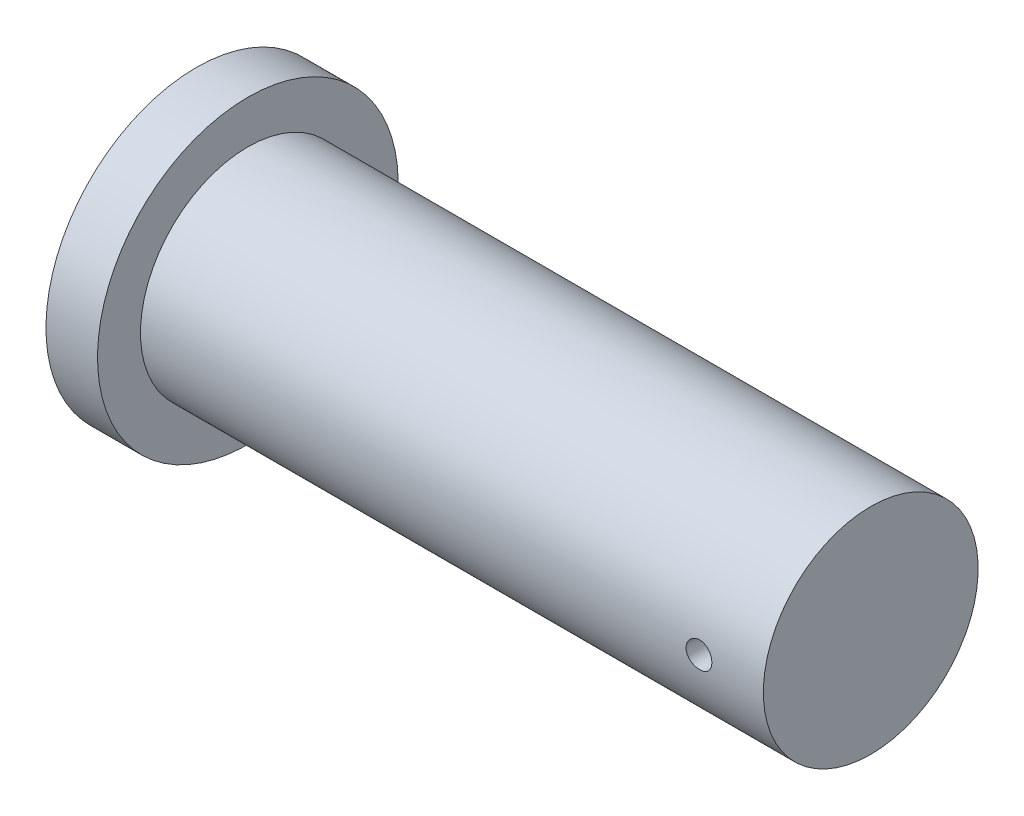
ISO-10303-21;
HEADER;
FILE_DESCRIPTION(('STEP AP214'),'2;1');
FILE_NAME('part.step','',(''),(''),'','','');
FILE_SCHEMA(('AUTOMOTIVE_DESIGN { 1 0 10303 214 1 1 1 1 }'));
ENDSEC;
DATA;
#1=APPLICATION_CONTEXT('core data for automotive mechanical design processes');
#2=APPLICATION_PROTOCOL_DEFINITION('international standard','automotive_design',2000,#1);
#3=PRODUCT_CONTEXT('',#1,'mechanical');
#4=PRODUCT('Part','Part','',(#3));
#5=PRODUCT_RELATED_PRODUCT_CATEGORY('part','',(#4));
#6=PRODUCT_DEFINITION_FORMATION('','',#4);
#7=PRODUCT_DEFINITION_CONTEXT('part definition',#1,'design');
#8=PRODUCT_DEFINITION('design','',#6,#7);
#9=PRODUCT_DEFINITION_SHAPE('','',#8);
#10=(LENGTH_UNIT() NAMED_UNIT(*) SI_UNIT(.MILLI.,.METRE.));
#11=(NAMED_UNIT(*) PLANE_ANGLE_UNIT() SI_UNIT($,.RADIAN.));
#12=(NAMED_UNIT(*) SI_UNIT($,.STERADIAN.) SOLID_ANGLE_UNIT());
#13=UNCERTAINTY_MEASURE_WITH_UNIT(LENGTH_MEASURE(1.E-05),#10,'distance_accuracy_value','');
#14=(GEOMETRIC_REPRESENTATION_CONTEXT(3) GLOBAL_UNCERTAINTY_ASSIGNED_CONTEXT((#13)) GLOBAL_UNIT_ASSIGNED_CONTEXT((#10,
#11,#12)) REPRESENTATION_CONTEXT('',''));
#15=CARTESIAN_POINT('',(0.,0.,0.));
#16=DIRECTION('',(0.,0.,1.));
#17=DIRECTION('',(1.,0.,0.));
#18=AXIS2_PLACEMENT_3D('',#15,#16,#17);
#19=CARTESIAN_POINT('',(-157.,0.,0.));
#20=DIRECTION('',(-1.,0.,0.));
#21=DIRECTION('',(0.,-1.,0.));
#22=AXIS2_PLACEMENT_3D('',#19,#20,#21);
#23=PLANE('',#22);
#24=CARTESIAN_POINT('',(-157.,0.,0.));
#25=DIRECTION('',(1.,0.,0.));
#26=DIRECTION('',(0.,1.,0.));
#27=AXIS2_PLACEMENT_3D('',#24,#25,#26);
#28=CIRCLE('',#27,35.);
#29=CARTESIAN_POINT('',(-157.,35.,0.));
#30=VERTEX_POINT('',#29);
#31=EDGE_CURVE('E10',#30,#30,#28,.T.);
#32=ORIENTED_EDGE('',*,*,#31,.F.);
#33=EDGE_LOOP('',(#32));
#34=FACE_BOUND('',#33,.T.);
#35=ADVANCED_FACE('F37',(#34),#23,.T.);
#36=CARTESIAN_POINT('',(0.,0.,0.));
#37=DIRECTION('',(1.,0.,0.));
#38=DIRECTION('',(0.,1.,0.));
#39=AXIS2_PLACEMENT_3D('',#36,#37,#38);
#40=CYLINDRICAL_SURFACE('',#39,35.);
#41=ORIENTED_EDGE('',*,*,#31,.T.);
#42=EDGE_LOOP('',(#41));
#43=FACE_BOUND('',#42,.T.);
#44=CARTESIAN_POINT('',(-145.,0.,0.));
#45=DIRECTION('',(1.,0.,0.));
#46=DIRECTION('',(0.,1.,0.));
#47=AXIS2_PLACEMENT_3D('',#44,#45,#46);
#48=CIRCLE('',#47,35.);
#49=CARTESIAN_POINT('',(-145.,35.,0.));
#50=VERTEX_POINT('',#49);
#51=EDGE_CURVE('E50',#50,#50,#48,.T.);
#52=ORIENTED_EDGE('',*,*,#51,.F.);
#53=EDGE_LOOP('',(#52));
#54=FACE_BOUND('',#53,.T.);
#55=ADVANCED_FACE('F84',(#43,#54),#40,.T.);
#56=CARTESIAN_POINT('',(-145.,35.,0.));
#57=DIRECTION('',(1.,0.,0.));
#58=DIRECTION('',(0.,1.,0.));
#59=AXIS2_PLACEMENT_3D('',#56,#57,#58);
#60=PLANE('',#59);
#61=ORIENTED_EDGE('',*,*,#51,.T.);
#62=EDGE_LOOP('',(#61));
#63=FACE_BOUND('',#62,.T.);
#64=CARTESIAN_POINT('',(-145.,0.,0.));
#65=DIRECTION('',(1.,0.,0.));
#66=DIRECTION('',(0.,1.,0.));
#67=AXIS2_PLACEMENT_3D('',#64,#65,#66);
#68=CIRCLE('',#67,25.);
#69=CARTESIAN_POINT('',(-145.,25.,0.));
#70=VERTEX_POINT('',#69);
#71=EDGE_CURVE('E56',#70,#70,#68,.T.);
#72=ORIENTED_EDGE('',*,*,#71,.F.);
#73=EDGE_LOOP('',(#72));
#74=FACE_BOUND('',#73,.T.);
#75=ADVANCED_FACE('F80',(#63,#74),#60,.T.);
#76=CARTESIAN_POINT('',(0.,0.,0.));
#77=DIRECTION('',(1.,0.,0.));
#78=DIRECTION('',(0.,1.,0.));
#79=AXIS2_PLACEMENT_3D('',#76,#77,#78);
#80=CYLINDRICAL_SURFACE('',#79,25.);
#81=CARTESIAN_POINT('',(-12.,0.,-25.));
#82=CARTESIAN_POINT('',(-12.0000071639414,-0.1678640471077,-24.9999977357459));
#83=CARTESIAN_POINT('',(-12.0141366586927,-0.335834317331192,-24.9982914200408));
#84=CARTESIAN_POINT('',(-12.0702810641554,-0.66710457130825,-24.991648705422));
#85=CARTESIAN_POINT('',(-12.1123254412506,-0.830399429590069,-24.9867088933728));
#86=CARTESIAN_POINT('',(-12.223046276526,-1.14747479534053,-24.9741559265426));
#87=CARTESIAN_POINT('',(-12.2917052068242,-1.30126148759225,-24.9665445315309));
#88=CARTESIAN_POINT('',(-12.4536687350833,-1.595099157832,-24.9494959264345));
#89=CARTESIAN_POINT('',(-12.5469689597533,-1.73515256713516,-24.9400590404141));
#90=CARTESIAN_POINT('',(-12.7560748619752,-1.99829131534451,-24.920360105442));
#91=CARTESIAN_POINT('',(-12.8719808401119,-2.1212966913072,-24.9100945030904));
#92=CARTESIAN_POINT('',(-13.1227929648879,-2.34615931038342,-24.8899239397152));
#93=CARTESIAN_POINT('',(-13.2577000590186,-2.44801549826474,-24.8800189967068));
#94=CARTESIAN_POINT('',(-13.5432008252984,-2.62798342873896,-24.8616560370404));
#95=CARTESIAN_POINT('',(-13.6938417245801,-2.7060207567257,-24.8532025903971));
#96=CARTESIAN_POINT('',(-14.0062087021087,-2.8356605730156,-24.8387461344686));
#97=CARTESIAN_POINT('',(-14.1679343919693,-2.88726398696776,-24.8327430393798));
#98=CARTESIAN_POINT('',(-14.4970528593114,-2.962329300454,-24.8239006073737));
#99=CARTESIAN_POINT('',(-14.6644145284277,-2.98592577987646,-24.8210461452543));
#100=CARTESIAN_POINT('',(-15.0007449363642,-3.0047237521967,-24.8187777690611));
#101=CARTESIAN_POINT('',(-15.169713615217,-2.99992630052848,-24.8193637271032));
#102=CARTESIAN_POINT('',(-15.5035259647843,-2.96218316078668,-24.8238961466306));
#103=CARTESIAN_POINT('',(-15.6683866386802,-2.92938543222303,-24.8278249434675));
#104=CARTESIAN_POINT('',(-15.9902470278213,-2.83680346170067,-24.8385728087608));
#105=CARTESIAN_POINT('',(-16.147246595179,-2.77701871225814,-24.8453919315687));
#106=CARTESIAN_POINT('',(-16.4493894682391,-2.63199980699862,-24.8611722079476));
#107=CARTESIAN_POINT('',(-16.5945014783535,-2.54670106203925,-24.8701387862198));
#108=CARTESIAN_POINT('',(-16.8684072109158,-2.35312173169469,-24.8891993987901));
#109=CARTESIAN_POINT('',(-16.9972002449026,-2.24484017723157,-24.8992934806213));
#110=CARTESIAN_POINT('',(-17.2356710843644,-2.0075475556218,-24.9195503308637));
#111=CARTESIAN_POINT('',(-17.345221969857,-1.87840890051216,-24.929713127424));
#112=CARTESIAN_POINT('',(-17.5411115210003,-1.60350795893872,-24.9489020798549));
#113=CARTESIAN_POINT('',(-17.6274501400191,-1.45774563908005,-24.9579282334421));
#114=CARTESIAN_POINT('',(-17.7744632856396,-1.15363930826284,-24.9738318861702));
#115=CARTESIAN_POINT('',(-17.8351301933304,-0.995291578715591,-24.9807087472809));
#116=CARTESIAN_POINT('',(-17.9289787378509,-0.67055602227344,-24.991533065309));
#117=CARTESIAN_POINT('',(-17.9621615600045,-0.504168542441624,-24.9954806485584));
#118=CARTESIAN_POINT('',(-17.9999362554977,-0.169174396374217,-24.9999852500304));
#119=CARTESIAN_POINT('',(-18.0047030324007,-0.000587720432051824,-25.0005630093753));
#120=CARTESIAN_POINT('',(-17.9859714221317,0.33498206824326,-24.9983187823231));
#121=CARTESIAN_POINT('',(-17.9624735887046,0.501965212327328,-24.9954968625308));
#122=CARTESIAN_POINT('',(-17.8880250359969,0.829074263928356,-24.9867833380686));
#123=CARTESIAN_POINT('',(-17.8371573869499,0.989219346369034,-24.9809010237909));
#124=CARTESIAN_POINT('',(-17.7094992966464,1.29870539768646,-24.9667255501792));
#125=CARTESIAN_POINT('',(-17.6327080385099,1.44804602592347,-24.9584323148759));
#126=CARTESIAN_POINT('',(-17.4549570840976,1.73246717766504,-24.9403085158695));
#127=CARTESIAN_POINT('',(-17.3538838621892,1.86747628962751,-24.9304708084643));
#128=CARTESIAN_POINT('',(-17.1305991535918,2.11867625152204,-24.9103817919419));
#129=CARTESIAN_POINT('',(-17.008386895852,2.23486641472949,-24.9001304677484));
#130=CARTESIAN_POINT('',(-16.7455243845723,2.44574795226154,-24.8803059484942));
#131=CARTESIAN_POINT('',(-16.6047809846561,2.54032363231939,-24.8707365831307));
#132=CARTESIAN_POINT('',(-16.3093049749244,2.70449314429332,-24.8534214993383));
#133=CARTESIAN_POINT('',(-16.1545726268817,2.77408744356074,-24.8456757467942));
#134=CARTESIAN_POINT('',(-15.8358893911053,2.88612996668159,-24.8329105734502));
#135=CARTESIAN_POINT('',(-15.6719619881406,2.92864420159346,-24.8278845275633));
#136=CARTESIAN_POINT('',(-15.3392310305149,2.98553272163517,-24.8211085274587));
#137=CARTESIAN_POINT('',(-15.1704276838427,2.99990820526081,-24.8193584337106));
#138=CARTESIAN_POINT('',(-14.8338872703628,3.00009033817931,-24.8193363266069));
#139=CARTESIAN_POINT('',(-14.6661502742287,2.98607873671351,-24.8210421863943));
#140=CARTESIAN_POINT('',(-14.3354332136058,2.93026848672089,-24.8276922947425));
#141=CARTESIAN_POINT('',(-14.1724531508244,2.88846982822067,-24.8326365444656));
#142=CARTESIAN_POINT('',(-13.8558954611113,2.77832739820545,-24.8451996524586));
#143=CARTESIAN_POINT('',(-13.7023150065045,2.70999165570539,-24.8528177016812));
#144=CARTESIAN_POINT('',(-13.4087722529299,2.5487328262801,-24.8698714539138));
#145=CARTESIAN_POINT('',(-13.2688100715407,2.45580952709445,-24.8793071726153));
#146=CARTESIAN_POINT('',(-13.0055470598911,2.24733689647205,-24.8990055122587));
#147=CARTESIAN_POINT('',(-12.8823538967337,2.1316520393015,-24.9092728581347));
#148=CARTESIAN_POINT('',(-12.657057520434,1.88122093334448,-24.9294354968169));
#149=CARTESIAN_POINT('',(-12.5549593023708,1.74647018263601,-24.939330701051));
#150=CARTESIAN_POINT('',(-12.3744494220011,1.46119322465137,-24.9576721709324));
#151=CARTESIAN_POINT('',(-12.2961222742777,1.31061323462418,-24.966113221621));
#152=CARTESIAN_POINT('',(-12.1659762355574,0.998422751685312,-24.9805418519726));
#153=CARTESIAN_POINT('',(-12.1141283038196,0.836824564362145,-24.9865321180615));
#154=CARTESIAN_POINT('',(-12.0509365796619,0.561977101236698,-24.9939268325999));
#155=CARTESIAN_POINT('',(-12.0318625161136,0.450466569753488,-24.996193279433));
#156=CARTESIAN_POINT('',(-12.006391856509,0.225986735693695,-24.9992306204204));
#157=CARTESIAN_POINT('',(-11.9999951767495,0.113017442753626,-25.0000015244492));
#158=CARTESIAN_POINT('',(-12.,0.,-25.));
#159=B_SPLINE_CURVE_WITH_KNOTS('',3,(#81,#82,#83,#84,#85,#86,#87,#88,#89,#90,#91,#92,#93,#94,
#95,#96,#97,#98,#99,#100,#101,#102,#103,#104,#105,#106,#107,#108,#109,#110,#111,#112,#113,#114,
#115,#116,#117,#118,#119,#120,#121,#122,#123,#124,#125,#126,#127,#128,#129,#130,#131,#132,#133,
#134,#135,#136,#137,#138,#139,#140,#141,#142,#143,#144,#145,#146,#147,#148,#149,#150,#151,#152,
#153,#154,#155,#156,#157,#158),.UNSPECIFIED.,.T.,.F.,(4,2,2,2,2,2,2,2,2,2,2,2,2,2,2,2,2,2,2,2,2,
2,2,2,2,2,2,2,2,2,2,2,2,2,2,2,2,2,4),(0.,0.50317935095616,1.00689069408623,1.5102708637556,
2.01356175441693,2.51913872195878,3.02474090904883,3.53190689496397,4.03905511999114,
4.54375638343279,5.0484388866848,5.55047092912253,6.05251241253396,6.55583573710536,
7.05918028869262,7.56572944640317,8.07227962172601,8.57898002694279,9.08565857822619,
9.58921522624227,10.0927620090108,10.5947890255775,11.0968318630167,11.6012692178556,
12.1057249760357,12.6128207581672,13.119907053063,13.6257524826489,14.1315763666154,
14.6341719319229,15.1367676776234,15.6392114771388,16.1416596143122,16.6471952402032,
17.1528504352009,17.6602829023946,18.1671576479275,18.5059342945627,18.8447087043981),.UNSPECIFIED.);
#160=CARTESIAN_POINT('',(-12.,0.,-25.));
#161=VERTEX_POINT('',#160);
#162=EDGE_CURVE('E40',#161,#161,#159,.T.);
#163=ORIENTED_EDGE('',*,*,#162,.F.);
#164=EDGE_LOOP('',(#163));
#165=FACE_BOUND('',#164,.T.);
#166=CARTESIAN_POINT('',(-12.,0.,25.));
#167=CARTESIAN_POINT('',(-12.0000071639414,0.167864047107699,24.9999977357459));
#168=CARTESIAN_POINT('',(-12.0141366586927,0.335834317331191,24.9982914200408));
#169=CARTESIAN_POINT('',(-12.0702810641554,0.66710457130825,24.991648705422));
#170=CARTESIAN_POINT('',(-12.1123254412506,0.830399429590069,24.9867088933728));
#171=CARTESIAN_POINT('',(-12.223046276526,1.14747479534053,24.9741559265426));
#172=CARTESIAN_POINT('',(-12.2917052068242,1.30126148759225,24.9665445315309));
#173=CARTESIAN_POINT('',(-12.4536687350833,1.595099157832,24.9494959264345));
#174=CARTESIAN_POINT('',(-12.5469689597533,1.73515256713516,24.9400590404141));
#175=CARTESIAN_POINT('',(-12.7560748619752,1.99829131534451,24.920360105442));
#176=CARTESIAN_POINT('',(-12.8719808401119,2.1212966913072,24.9100945030904));
#177=CARTESIAN_POINT('',(-13.1227929648879,2.34615931038342,24.8899239397152));
#178=CARTESIAN_POINT('',(-13.2577000590186,2.44801549826474,24.8800189967068));
#179=CARTESIAN_POINT('',(-13.5432008252984,2.62798342873896,24.8616560370404));
#180=CARTESIAN_POINT('',(-13.6938417245801,2.7060207567257,24.8532025903971));
#181=CARTESIAN_POINT('',(-14.0062087021087,2.8356605730156,24.8387461344686));
#182=CARTESIAN_POINT('',(-14.1679343919693,2.88726398696776,24.8327430393798));
#183=CARTESIAN_POINT('',(-14.4970528593114,2.962329300454,24.8239006073737));
#184=CARTESIAN_POINT('',(-14.6644145284277,2.98592577987646,24.8210461452542));
#185=CARTESIAN_POINT('',(-15.0007449363642,3.0047237521967,24.8187777690611));
#186=CARTESIAN_POINT('',(-15.169713615217,2.99992630052848,24.8193637271032));
#187=CARTESIAN_POINT('',(-15.5035259647843,2.96218316078668,24.8238961466306));
#188=CARTESIAN_POINT('',(-15.6683866386802,2.92938543222303,24.8278249434675));
#189=CARTESIAN_POINT('',(-15.9902470278213,2.83680346170067,24.8385728087608));
#190=CARTESIAN_POINT('',(-16.147246595179,2.77701871225814,24.8453919315687));
#191=CARTESIAN_POINT('',(-16.4493894682391,2.63199980699862,24.8611722079476));
#192=CARTESIAN_POINT('',(-16.5945014783535,2.54670106203925,24.8701387862198));
#193=CARTESIAN_POINT('',(-16.8684072109158,2.35312173169469,24.8891993987901));
#194=CARTESIAN_POINT('',(-16.9972002449026,2.24484017723157,24.8992934806213));
#195=CARTESIAN_POINT('',(-17.2356710843644,2.0075475556218,24.9195503308637));
#196=CARTESIAN_POINT('',(-17.345221969857,1.87840890051216,24.929713127424));
#197=CARTESIAN_POINT('',(-17.5411115210003,1.60350795893872,24.9489020798549));
#198=CARTESIAN_POINT('',(-17.6274501400191,1.45774563908005,24.9579282334421));
#199=CARTESIAN_POINT('',(-17.7744632856396,1.15363930826284,24.9738318861702));
#200=CARTESIAN_POINT('',(-17.8351301933304,0.995291578715591,24.9807087472809));
#201=CARTESIAN_POINT('',(-17.9289787378509,0.67055602227344,24.991533065309));
#202=CARTESIAN_POINT('',(-17.9621615600045,0.504168542441623,24.9954806485584));
#203=CARTESIAN_POINT('',(-17.9999362554977,0.169174396374217,24.9999852500304));
#204=CARTESIAN_POINT('',(-18.0047030324007,0.00058772043205223,25.0005630093753));
#205=CARTESIAN_POINT('',(-17.9859714221317,-0.33498206824326,24.9983187823231));
#206=CARTESIAN_POINT('',(-17.9624735887046,-0.501965212327329,24.9954968625308));
#207=CARTESIAN_POINT('',(-17.8880250359969,-0.829074263928357,24.9867833380686));
#208=CARTESIAN_POINT('',(-17.8371573869499,-0.989219346369035,24.9809010237909));
#209=CARTESIAN_POINT('',(-17.7094992966464,-1.29870539768646,24.9667255501792));
#210=CARTESIAN_POINT('',(-17.6327080385099,-1.44804602592347,24.9584323148759));
#211=CARTESIAN_POINT('',(-17.4549570840976,-1.73246717766505,24.9403085158695));
#212=CARTESIAN_POINT('',(-17.3538838621892,-1.86747628962751,24.9304708084643));
#213=CARTESIAN_POINT('',(-17.1305991535918,-2.11867625152204,24.9103817919419));
#214=CARTESIAN_POINT('',(-17.008386895852,-2.23486641472949,24.9001304677484));
#215=CARTESIAN_POINT('',(-16.7455243845723,-2.44574795226154,24.8803059484942));
#216=CARTESIAN_POINT('',(-16.6047809846561,-2.54032363231939,24.8707365831307));
#217=CARTESIAN_POINT('',(-16.3093049749244,-2.70449314429332,24.8534214993383));
#218=CARTESIAN_POINT('',(-16.1545726268817,-2.77408744356074,24.8456757467942));
#219=CARTESIAN_POINT('',(-15.8358893911053,-2.88612996668159,24.8329105734502));
#220=CARTESIAN_POINT('',(-15.6719619881406,-2.92864420159346,24.8278845275633));
#221=CARTESIAN_POINT('',(-15.3392310305149,-2.98553272163517,24.8211085274587));
#222=CARTESIAN_POINT('',(-15.1704276838427,-2.99990820526081,24.8193584337106));
#223=CARTESIAN_POINT('',(-14.8338872703628,-3.00009033817931,24.8193363266069));
#224=CARTESIAN_POINT('',(-14.6661502742287,-2.98607873671351,24.8210421863943));
#225=CARTESIAN_POINT('',(-14.3354332136058,-2.93026848672089,24.8276922947425));
#226=CARTESIAN_POINT('',(-14.1724531508244,-2.88846982822067,24.8326365444656));
#227=CARTESIAN_POINT('',(-13.8558954611113,-2.77832739820545,24.8451996524586));
#228=CARTESIAN_POINT('',(-13.7023150065045,-2.70999165570539,24.8528177016812));
#229=CARTESIAN_POINT('',(-13.4087722529299,-2.5487328262801,24.8698714539138));
#230=CARTESIAN_POINT('',(-13.2688100715407,-2.45580952709445,24.8793071726153));
#231=CARTESIAN_POINT('',(-13.0055470598911,-2.24733689647205,24.8990055122587));
#232=CARTESIAN_POINT('',(-12.8823538967337,-2.1316520393015,24.9092728581347));
#233=CARTESIAN_POINT('',(-12.657057520434,-1.88122093334447,24.9294354968169));
#234=CARTESIAN_POINT('',(-12.5549593023708,-1.74647018263601,24.939330701051));
#235=CARTESIAN_POINT('',(-12.3744494220011,-1.46119322465137,24.9576721709324));
#236=CARTESIAN_POINT('',(-12.2961222742777,-1.31061323462418,24.966113221621));
#237=CARTESIAN_POINT('',(-12.1659762355574,-0.998422751685313,24.9805418519727));
#238=CARTESIAN_POINT('',(-12.1141283038196,-0.836824564362145,24.9865321180615));
#239=CARTESIAN_POINT('',(-12.0509365796619,-0.561977101236697,24.9939268325999));
#240=CARTESIAN_POINT('',(-12.0318625161136,-0.450466569753487,24.996193279433));
#241=CARTESIAN_POINT('',(-12.006391856509,-0.225986735693694,24.9992306204204));
#242=CARTESIAN_POINT('',(-11.9999951767495,-0.113017442753625,25.0000015244492));
#243=CARTESIAN_POINT('',(-12.,0.,25.));
#244=B_SPLINE_CURVE_WITH_KNOTS('',3,(#166,#167,#168,#169,#170,#171,#172,#173,#174,#175,#176,
#177,#178,#179,#180,#181,#182,#183,#184,#185,#186,#187,#188,#189,#190,#191,#192,#193,#194,#195,
#196,#197,#198,#199,#200,#201,#202,#203,#204,#205,#206,#207,#208,#209,#210,#211,#212,#213,#214,
#215,#216,#217,#218,#219,#220,#221,#222,#223,#224,#225,#226,#227,#228,#229,#230,#231,#232,#233,
#234,#235,#236,#237,#238,#239,#240,#241,#242,#243),.UNSPECIFIED.,.T.,.F.,(4,2,2,2,2,2,2,2,2,2,2,
2,2,2,2,2,2,2,2,2,2,2,2,2,2,2,2,2,2,2,2,2,2,2,2,2,2,2,4),(0.,0.50317935095616,1.00689069408623,
1.5102708637556,2.01356175441693,2.51913872195878,3.02474090904883,3.53190689496397,
4.03905511999114,4.54375638343279,5.0484388866848,5.55047092912253,6.05251241253396,
6.55583573710536,7.05918028869262,7.56572944640317,8.07227962172601,8.57898002694279,
9.08565857822619,9.58921522624227,10.0927620090108,10.5947890255775,11.0968318630167,
11.6012692178556,12.1057249760357,12.6128207581672,13.119907053063,13.6257524826489,
14.1315763666154,14.6341719319229,15.1367676776234,15.6392114771388,16.1416596143122,
16.6471952402032,17.1528504352009,17.6602829023946,18.1671576479275,18.5059342945627,
18.8447087043981),.UNSPECIFIED.);
#245=CARTESIAN_POINT('',(-12.,0.,25.));
#246=VERTEX_POINT('',#245);
#247=EDGE_CURVE('E59',#246,#246,#244,.T.);
#248=ORIENTED_EDGE('',*,*,#247,.F.);
#249=EDGE_LOOP('',(#248));
#250=FACE_BOUND('',#249,.T.);
#251=ORIENTED_EDGE('',*,*,#71,.T.);
#252=EDGE_LOOP('',(#251));
#253=FACE_BOUND('',#252,.T.);
#254=CARTESIAN_POINT('',(0.,0.,0.));
#255=DIRECTION('',(1.,0.,0.));
#256=DIRECTION('',(0.,1.,0.));
#257=AXIS2_PLACEMENT_3D('',#254,#255,#256);
#258=CIRCLE('',#257,25.);
#259=CARTESIAN_POINT('',(0.,25.,0.));
#260=VERTEX_POINT('',#259);
#261=EDGE_CURVE('E100',#260,#260,#258,.T.);
#262=ORIENTED_EDGE('',*,*,#261,.F.);
#263=EDGE_LOOP('',(#262));
#264=FACE_BOUND('',#263,.T.);
#265=ADVANCED_FACE('F65',(#165,#250,#253,#264),#80,.T.);
#266=CARTESIAN_POINT('',(0.,25.,0.));
#267=DIRECTION('',(1.,0.,0.));
#268=DIRECTION('',(0.,1.,0.));
#269=AXIS2_PLACEMENT_3D('',#266,#267,#268);
#270=PLANE('',#269);
#271=ORIENTED_EDGE('',*,*,#261,.T.);
#272=EDGE_LOOP('',(#271));
#273=FACE_BOUND('',#272,.T.);
#274=ADVANCED_FACE('F72',(#273),#270,.T.);
#275=CARTESIAN_POINT('',(-15.,0.,-35.));
#276=DIRECTION('',(0.,0.,1.));
#277=DIRECTION('',(1.,0.,0.));
#278=AXIS2_PLACEMENT_3D('',#275,#276,#277);
#279=CYLINDRICAL_SURFACE('',#278,3.);
#280=ORIENTED_EDGE('',*,*,#162,.T.);
#281=EDGE_LOOP('',(#280));
#282=FACE_BOUND('',#281,.T.);
#283=ORIENTED_EDGE('',*,*,#247,.T.);
#284=EDGE_LOOP('',(#283));
#285=FACE_BOUND('',#284,.T.);
#286=ADVANCED_FACE('F69',(#282,#285),#279,.F.);
#287=CLOSED_SHELL('',(#35,#55,#75,#265,#274,#286));
#288=MANIFOLD_SOLID_BREP('B2',#287);
#289=ADVANCED_BREP_SHAPE_REPRESENTATION('',(#18,#288),#14);
#290=SHAPE_DEFINITION_REPRESENTATION(#9,#289);
ENDSEC;
END-ISO-10303-21;
